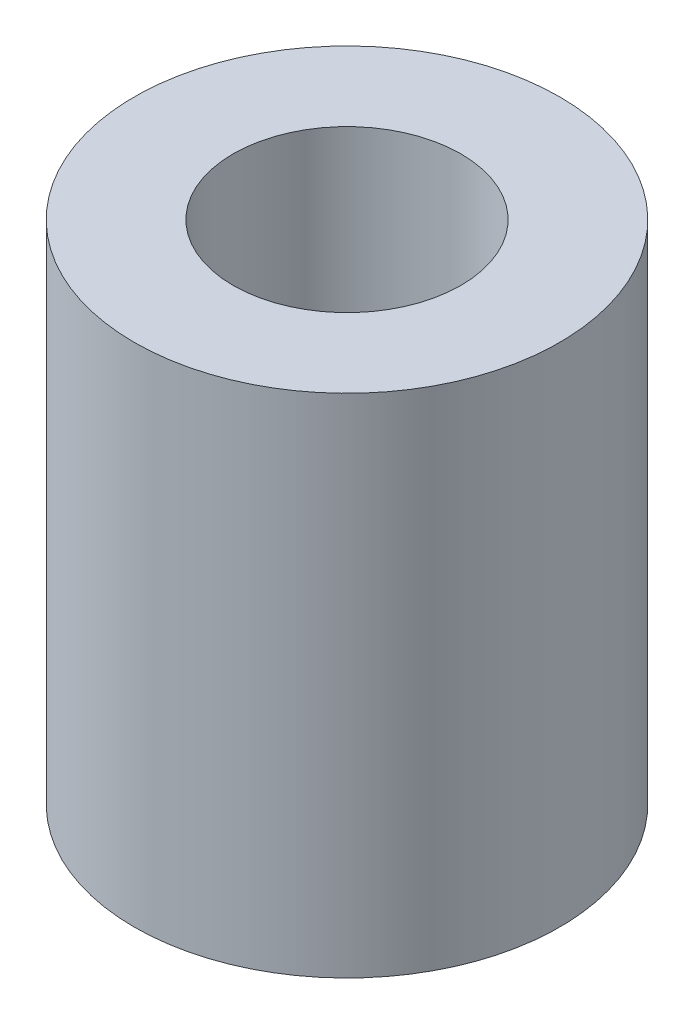
ISO-10303-21;
HEADER;
FILE_DESCRIPTION(('STEP AP214'),'2;1');
FILE_NAME('part.step','',(''),(''),'','','');
FILE_SCHEMA(('AUTOMOTIVE_DESIGN { 1 0 10303 214 1 1 1 1 }'));
ENDSEC;
DATA;
#1=APPLICATION_CONTEXT('core data for automotive mechanical design processes');
#2=APPLICATION_PROTOCOL_DEFINITION('international standard','automotive_design',2000,#1);
#3=PRODUCT_CONTEXT('',#1,'mechanical');
#4=PRODUCT('Part','Part','',(#3));
#5=PRODUCT_RELATED_PRODUCT_CATEGORY('part','',(#4));
#6=PRODUCT_DEFINITION_FORMATION('','',#4);
#7=PRODUCT_DEFINITION_CONTEXT('part definition',#1,'design');
#8=PRODUCT_DEFINITION('design','',#6,#7);
#9=PRODUCT_DEFINITION_SHAPE('','',#8);
#10=(LENGTH_UNIT() NAMED_UNIT(*) SI_UNIT(.MILLI.,.METRE.));
#11=(NAMED_UNIT(*) PLANE_ANGLE_UNIT() SI_UNIT($,.RADIAN.));
#12=(NAMED_UNIT(*) SI_UNIT($,.STERADIAN.) SOLID_ANGLE_UNIT());
#13=UNCERTAINTY_MEASURE_WITH_UNIT(LENGTH_MEASURE(1.E-05),#10,'distance_accuracy_value','');
#14=(GEOMETRIC_REPRESENTATION_CONTEXT(3) GLOBAL_UNCERTAINTY_ASSIGNED_CONTEXT((#13)) GLOBAL_UNIT_ASSIGNED_CONTEXT((#10,
#11,#12)) REPRESENTATION_CONTEXT('',''));
#15=CARTESIAN_POINT('',(0.,0.,0.));
#16=DIRECTION('',(0.,0.,1.));
#17=DIRECTION('',(1.,0.,0.));
#18=AXIS2_PLACEMENT_3D('',#15,#16,#17);
#19=CARTESIAN_POINT('',(0.,10.,0.));
#20=DIRECTION('',(0.,1.,0.));
#21=DIRECTION('',(0.,0.,1.));
#22=AXIS2_PLACEMENT_3D('',#19,#20,#21);
#23=PLANE('',#22);
#24=CARTESIAN_POINT('',(0.,10.,0.));
#25=DIRECTION('',(0.,1.,0.));
#26=DIRECTION('',(0.,0.,1.));
#27=AXIS2_PLACEMENT_3D('',#24,#25,#26);
#28=CIRCLE('',#27,4.2);
#29=CARTESIAN_POINT('',(0.,10.,4.2));
#30=VERTEX_POINT('',#29);
#31=EDGE_CURVE('E10',#30,#30,#28,.T.);
#32=ORIENTED_EDGE('',*,*,#31,.T.);
#33=EDGE_LOOP('',(#32));
#34=FACE_BOUND('',#33,.T.);
#35=CARTESIAN_POINT('',(0.,10.,0.));
#36=DIRECTION('',(0.,1.,0.));
#37=DIRECTION('',(0.,0.,1.));
#38=AXIS2_PLACEMENT_3D('',#35,#36,#37);
#39=CIRCLE('',#38,2.25);
#40=CARTESIAN_POINT('',(0.,10.,2.25));
#41=VERTEX_POINT('',#40);
#42=EDGE_CURVE('E42',#41,#41,#39,.T.);
#43=ORIENTED_EDGE('',*,*,#42,.F.);
#44=EDGE_LOOP('',(#43));
#45=FACE_BOUND('',#44,.T.);
#46=ADVANCED_FACE('F31',(#34,#45),#23,.T.);
#47=CARTESIAN_POINT('',(0.,0.,0.));
#48=DIRECTION('',(0.,1.,0.));
#49=DIRECTION('',(0.,0.,1.));
#50=AXIS2_PLACEMENT_3D('',#47,#48,#49);
#51=PLANE('',#50);
#52=CARTESIAN_POINT('',(0.,0.,0.));
#53=DIRECTION('',(0.,1.,0.));
#54=DIRECTION('',(0.,0.,1.));
#55=AXIS2_PLACEMENT_3D('',#52,#53,#54);
#56=CIRCLE('',#55,4.2);
#57=CARTESIAN_POINT('',(0.,0.,4.2));
#58=VERTEX_POINT('',#57);
#59=EDGE_CURVE('E35',#58,#58,#56,.T.);
#60=ORIENTED_EDGE('',*,*,#59,.F.);
#61=EDGE_LOOP('',(#60));
#62=FACE_BOUND('',#61,.T.);
#63=CARTESIAN_POINT('',(0.,0.,0.));
#64=DIRECTION('',(0.,1.,0.));
#65=DIRECTION('',(0.,0.,1.));
#66=AXIS2_PLACEMENT_3D('',#63,#64,#65);
#67=CIRCLE('',#66,2.25);
#68=CARTESIAN_POINT('',(0.,0.,2.25));
#69=VERTEX_POINT('',#68);
#70=EDGE_CURVE('E44',#69,#69,#67,.T.);
#71=ORIENTED_EDGE('',*,*,#70,.T.);
#72=EDGE_LOOP('',(#71));
#73=FACE_BOUND('',#72,.T.);
#74=ADVANCED_FACE('F54',(#62,#73),#51,.F.);
#75=CARTESIAN_POINT('',(0.,10.,0.));
#76=DIRECTION('',(0.,-1.,0.));
#77=DIRECTION('',(0.,0.,-1.));
#78=AXIS2_PLACEMENT_3D('',#75,#76,#77);
#79=CYLINDRICAL_SURFACE('',#78,4.2);
#80=ORIENTED_EDGE('',*,*,#31,.F.);
#81=EDGE_LOOP('',(#80));
#82=FACE_BOUND('',#81,.T.);
#83=ORIENTED_EDGE('',*,*,#59,.T.);
#84=EDGE_LOOP('',(#83));
#85=FACE_BOUND('',#84,.T.);
#86=ADVANCED_FACE('F33',(#82,#85),#79,.T.);
#87=CARTESIAN_POINT('',(0.,10.,0.));
#88=DIRECTION('',(0.,-1.,0.));
#89=DIRECTION('',(0.,0.,-1.));
#90=AXIS2_PLACEMENT_3D('',#87,#88,#89);
#91=CYLINDRICAL_SURFACE('',#90,2.25);
#92=ORIENTED_EDGE('',*,*,#42,.T.);
#93=EDGE_LOOP('',(#92));
#94=FACE_BOUND('',#93,.T.);
#95=ORIENTED_EDGE('',*,*,#70,.F.);
#96=EDGE_LOOP('',(#95));
#97=FACE_BOUND('',#96,.T.);
#98=ADVANCED_FACE('F50',(#94,#97),#91,.F.);
#99=CLOSED_SHELL('',(#46,#74,#86,#98));
#100=MANIFOLD_SOLID_BREP('B2',#99);
#101=ADVANCED_BREP_SHAPE_REPRESENTATION('',(#18,#100),#14);
#102=SHAPE_DEFINITION_REPRESENTATION(#9,#101);
ENDSEC;
END-ISO-10303-21;
